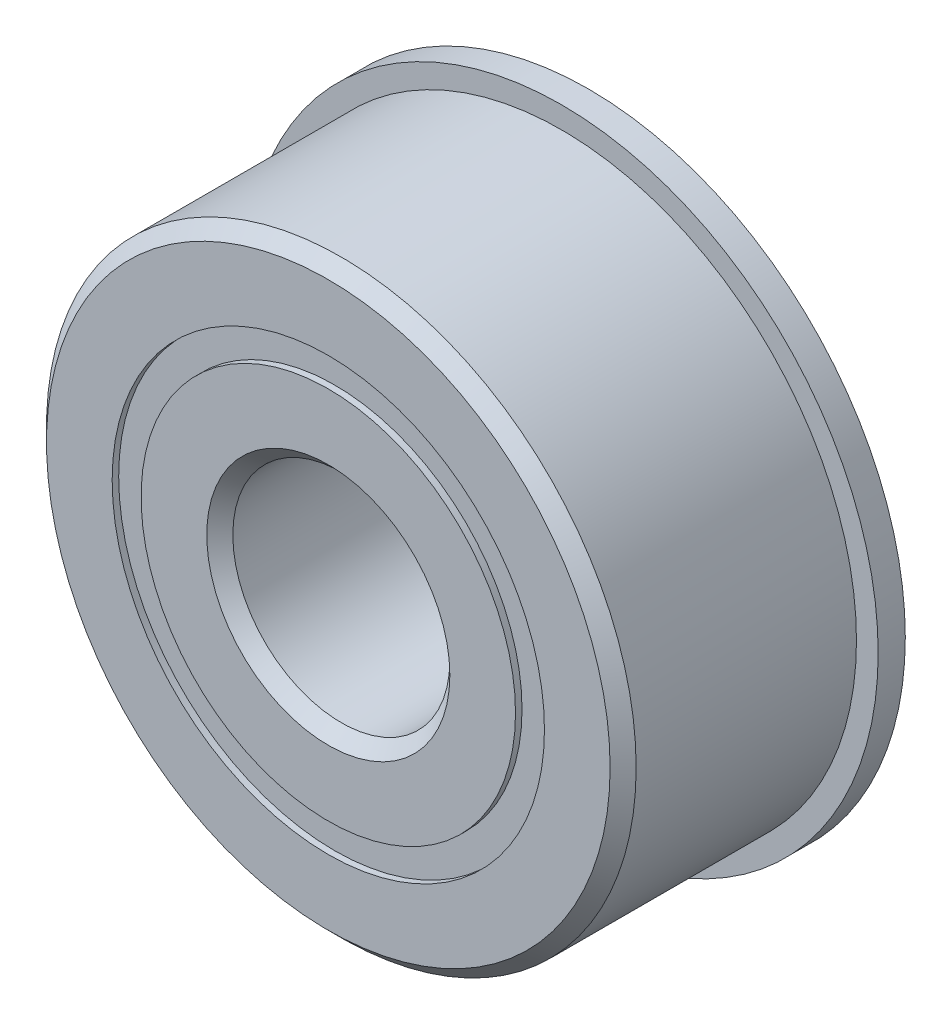
ISO-10303-21;
HEADER;
FILE_DESCRIPTION(('STEP AP214'),'2;1');
FILE_NAME('part.step','',(''),(''),'','','');
FILE_SCHEMA(('AUTOMOTIVE_DESIGN { 1 0 10303 214 1 1 1 1 }'));
ENDSEC;
DATA;
#1=APPLICATION_CONTEXT('core data for automotive mechanical design processes');
#2=APPLICATION_PROTOCOL_DEFINITION('international standard','automotive_design',2000,#1);
#3=PRODUCT_CONTEXT('',#1,'mechanical');
#4=PRODUCT('Part','Part','',(#3));
#5=PRODUCT_RELATED_PRODUCT_CATEGORY('part','',(#4));
#6=PRODUCT_DEFINITION_FORMATION('','',#4);
#7=PRODUCT_DEFINITION_CONTEXT('part definition',#1,'design');
#8=PRODUCT_DEFINITION('design','',#6,#7);
#9=PRODUCT_DEFINITION_SHAPE('','',#8);
#10=(LENGTH_UNIT() NAMED_UNIT(*) SI_UNIT(.MILLI.,.METRE.));
#11=(NAMED_UNIT(*) PLANE_ANGLE_UNIT() SI_UNIT($,.RADIAN.));
#12=(NAMED_UNIT(*) SI_UNIT($,.STERADIAN.) SOLID_ANGLE_UNIT());
#13=UNCERTAINTY_MEASURE_WITH_UNIT(LENGTH_MEASURE(1.E-05),#10,'distance_accuracy_value','');
#14=(GEOMETRIC_REPRESENTATION_CONTEXT(3) GLOBAL_UNCERTAINTY_ASSIGNED_CONTEXT((#13)) GLOBAL_UNIT_ASSIGNED_CONTEXT((#10,
#11,#12)) REPRESENTATION_CONTEXT('',''));
#15=CARTESIAN_POINT('',(0.,0.,0.));
#16=DIRECTION('',(0.,0.,1.));
#17=DIRECTION('',(1.,0.,0.));
#18=AXIS2_PLACEMENT_3D('',#15,#16,#17);
#19=CARTESIAN_POINT('',(0.,5.975,-3.42));
#20=DIRECTION('',(0.,0.,1.));
#21=DIRECTION('',(1.,0.,0.));
#22=AXIS2_PLACEMENT_3D('',#19,#20,#21);
#23=PLANE('',#22);
#24=CARTESIAN_POINT('',(0.,0.,-3.42));
#25=DIRECTION('',(0.,0.,1.));
#26=DIRECTION('',(1.,0.,0.));
#27=AXIS2_PLACEMENT_3D('',#24,#25,#26);
#28=CIRCLE('',#27,5.975);
#29=CARTESIAN_POINT('',(5.975,0.,-3.42));
#30=VERTEX_POINT('',#29);
#31=EDGE_CURVE('E57',#30,#30,#28,.T.);
#32=ORIENTED_EDGE('',*,*,#31,.F.);
#33=EDGE_LOOP('',(#32));
#34=FACE_BOUND('',#33,.T.);
#35=CARTESIAN_POINT('',(0.,0.,-3.42));
#36=DIRECTION('',(0.,0.,1.));
#37=DIRECTION('',(1.,0.,0.));
#38=AXIS2_PLACEMENT_3D('',#35,#36,#37);
#39=CIRCLE('',#38,5.175);
#40=CARTESIAN_POINT('',(5.175,0.,-3.42));
#41=VERTEX_POINT('',#40);
#42=EDGE_CURVE('E11',#41,#41,#39,.T.);
#43=ORIENTED_EDGE('',*,*,#42,.T.);
#44=EDGE_LOOP('',(#43));
#45=FACE_BOUND('',#44,.T.);
#46=ADVANCED_FACE('F43',(#34,#45),#23,.F.);
#47=CARTESIAN_POINT('',(0.,0.,3.6));
#48=DIRECTION('',(0.,0.,1.));
#49=DIRECTION('',(1.,0.,0.));
#50=AXIS2_PLACEMENT_3D('',#47,#48,#49);
#51=CYLINDRICAL_SURFACE('',#50,5.175);
#52=ORIENTED_EDGE('',*,*,#42,.F.);
#53=EDGE_LOOP('',(#52));
#54=FACE_BOUND('',#53,.T.);
#55=CARTESIAN_POINT('',(0.,0.,-1.64924225024706));
#56=DIRECTION('',(0.,0.,1.));
#57=DIRECTION('',(1.,0.,0.));
#58=AXIS2_PLACEMENT_3D('',#55,#56,#57);
#59=CIRCLE('',#58,5.175);
#60=CARTESIAN_POINT('',(5.175,0.,-1.64924225024706));
#61=VERTEX_POINT('',#60);
#62=EDGE_CURVE('E49',#61,#61,#59,.T.);
#63=ORIENTED_EDGE('',*,*,#62,.T.);
#64=EDGE_LOOP('',(#63));
#65=FACE_BOUND('',#64,.T.);
#66=ADVANCED_FACE('F66',(#54,#65),#51,.F.);
#67=CARTESIAN_POINT('',(0.,5.975,-1.64924225024706));
#68=DIRECTION('',(0.,0.,-1.));
#69=DIRECTION('',(-1.,0.,0.));
#70=AXIS2_PLACEMENT_3D('',#67,#68,#69);
#71=PLANE('',#70);
#72=ORIENTED_EDGE('',*,*,#62,.F.);
#73=EDGE_LOOP('',(#72));
#74=FACE_BOUND('',#73,.T.);
#75=CARTESIAN_POINT('',(0.,0.,-1.64924225024706));
#76=DIRECTION('',(0.,0.,1.));
#77=DIRECTION('',(1.,0.,0.));
#78=AXIS2_PLACEMENT_3D('',#75,#76,#77);
#79=CIRCLE('',#78,5.975);
#80=CARTESIAN_POINT('',(5.975,0.,-1.64924225024706));
#81=VERTEX_POINT('',#80);
#82=EDGE_CURVE('E53',#81,#81,#79,.T.);
#83=ORIENTED_EDGE('',*,*,#82,.T.);
#84=EDGE_LOOP('',(#83));
#85=FACE_BOUND('',#84,.T.);
#86=ADVANCED_FACE('F70',(#74,#85),#71,.F.);
#87=CARTESIAN_POINT('',(0.,0.,3.6));
#88=DIRECTION('',(0.,0.,1.));
#89=DIRECTION('',(1.,0.,0.));
#90=AXIS2_PLACEMENT_3D('',#87,#88,#89);
#91=CYLINDRICAL_SURFACE('',#90,5.975);
#92=ORIENTED_EDGE('',*,*,#82,.F.);
#93=EDGE_LOOP('',(#92));
#94=FACE_BOUND('',#93,.T.);
#95=ORIENTED_EDGE('',*,*,#31,.T.);
#96=EDGE_LOOP('',(#95));
#97=FACE_BOUND('',#96,.T.);
#98=ADVANCED_FACE('F63',(#94,#97),#91,.T.);
#99=CLOSED_SHELL('',(#46,#66,#86,#98));
#100=MANIFOLD_SOLID_BREP('B2',#99);
#101=CARTESIAN_POINT('',(0.,5.975,3.42));
#102=DIRECTION('',(0.,0.,-1.));
#103=DIRECTION('',(-1.,0.,0.));
#104=AXIS2_PLACEMENT_3D('',#101,#102,#103);
#105=PLANE('',#104);
#106=CARTESIAN_POINT('',(0.,0.,3.42));
#107=DIRECTION('',(0.,0.,1.));
#108=DIRECTION('',(1.,0.,0.));
#109=AXIS2_PLACEMENT_3D('',#106,#107,#108);
#110=CIRCLE('',#109,5.175);
#111=CARTESIAN_POINT('',(5.175,0.,3.42));
#112=VERTEX_POINT('',#111);
#113=EDGE_CURVE('E42',#112,#112,#110,.T.);
#114=ORIENTED_EDGE('',*,*,#113,.F.);
#115=EDGE_LOOP('',(#114));
#116=FACE_BOUND('',#115,.T.);
#117=CARTESIAN_POINT('',(0.,0.,3.42));
#118=DIRECTION('',(0.,0.,1.));
#119=DIRECTION('',(1.,0.,0.));
#120=AXIS2_PLACEMENT_3D('',#117,#118,#119);
#121=CIRCLE('',#120,5.975);
#122=CARTESIAN_POINT('',(5.975,0.,3.42));
#123=VERTEX_POINT('',#122);
#124=EDGE_CURVE('E124',#123,#123,#121,.T.);
#125=ORIENTED_EDGE('',*,*,#124,.T.);
#126=EDGE_LOOP('',(#125));
#127=FACE_BOUND('',#126,.T.);
#128=ADVANCED_FACE('F110',(#116,#127),#105,.F.);
#129=CARTESIAN_POINT('',(0.,0.,3.6));
#130=DIRECTION('',(0.,0.,1.));
#131=DIRECTION('',(1.,0.,0.));
#132=AXIS2_PLACEMENT_3D('',#129,#130,#131);
#133=CYLINDRICAL_SURFACE('',#132,5.175);
#134=CARTESIAN_POINT('',(0.,0.,1.64924225024706));
#135=DIRECTION('',(0.,0.,1.));
#136=DIRECTION('',(1.,0.,0.));
#137=AXIS2_PLACEMENT_3D('',#134,#135,#136);
#138=CIRCLE('',#137,5.175);
#139=CARTESIAN_POINT('',(5.175,0.,1.64924225024706));
#140=VERTEX_POINT('',#139);
#141=EDGE_CURVE('E116',#140,#140,#138,.T.);
#142=ORIENTED_EDGE('',*,*,#141,.F.);
#143=EDGE_LOOP('',(#142));
#144=FACE_BOUND('',#143,.T.);
#145=ORIENTED_EDGE('',*,*,#113,.T.);
#146=EDGE_LOOP('',(#145));
#147=FACE_BOUND('',#146,.T.);
#148=ADVANCED_FACE('F139',(#144,#147),#133,.F.);
#149=CARTESIAN_POINT('',(0.,5.975,1.64924225024706));
#150=DIRECTION('',(0.,0.,1.));
#151=DIRECTION('',(1.,0.,0.));
#152=AXIS2_PLACEMENT_3D('',#149,#150,#151);
#153=PLANE('',#152);
#154=CARTESIAN_POINT('',(0.,0.,1.64924225024706));
#155=DIRECTION('',(0.,0.,1.));
#156=DIRECTION('',(1.,0.,0.));
#157=AXIS2_PLACEMENT_3D('',#154,#155,#156);
#158=CIRCLE('',#157,5.975);
#159=CARTESIAN_POINT('',(5.975,0.,1.64924225024706));
#160=VERTEX_POINT('',#159);
#161=EDGE_CURVE('E120',#160,#160,#158,.T.);
#162=ORIENTED_EDGE('',*,*,#161,.F.);
#163=EDGE_LOOP('',(#162));
#164=FACE_BOUND('',#163,.T.);
#165=ORIENTED_EDGE('',*,*,#141,.T.);
#166=EDGE_LOOP('',(#165));
#167=FACE_BOUND('',#166,.T.);
#168=ADVANCED_FACE('F134',(#164,#167),#153,.F.);
#169=CARTESIAN_POINT('',(0.,0.,3.6));
#170=DIRECTION('',(0.,0.,1.));
#171=DIRECTION('',(1.,0.,0.));
#172=AXIS2_PLACEMENT_3D('',#169,#170,#171);
#173=CYLINDRICAL_SURFACE('',#172,5.975);
#174=ORIENTED_EDGE('',*,*,#124,.F.);
#175=EDGE_LOOP('',(#174));
#176=FACE_BOUND('',#175,.T.);
#177=ORIENTED_EDGE('',*,*,#161,.T.);
#178=EDGE_LOOP('',(#177));
#179=FACE_BOUND('',#178,.T.);
#180=ADVANCED_FACE('F131',(#176,#179),#173,.T.);
#181=CLOSED_SHELL('',(#128,#148,#168,#180));
#182=MANIFOLD_SOLID_BREP('B6',#181);
#183=CARTESIAN_POINT('',(-3.94212030511495,3.94212030511505,0.));
#184=DIRECTION('',(0.,0.,1.));
#185=DIRECTION('',(-0.707106781186539,0.707106781186556,0.));
#186=AXIS2_PLACEMENT_3D('',#183,#184,#185);
#187=SPHERICAL_SURFACE('',#186,1.64924225024706);
#188=CARTESIAN_POINT('',(-3.94212030511495,3.94212030511505,1.64924225024706));
#189=VERTEX_POINT('',#188);
#190=VERTEX_LOOP('',#189);
#191=FACE_BOUND('',#190,.T.);
#192=ADVANCED_FACE('F177',(#191),#187,.T.);
#193=CLOSED_SHELL('',(#192));
#194=MANIFOLD_SOLID_BREP('B37',#193);
#195=CARTESIAN_POINT('',(-5.575,0.,0.));
#196=DIRECTION('',(0.,0.,1.));
#197=DIRECTION('',(-1.,0.,0.));
#198=AXIS2_PLACEMENT_3D('',#195,#196,#197);
#199=SPHERICAL_SURFACE('',#198,1.64924225024706);
#200=CARTESIAN_POINT('',(-5.575,0.,1.64924225024706));
#201=VERTEX_POINT('',#200);
#202=VERTEX_LOOP('',#201);
#203=FACE_BOUND('',#202,.T.);
#204=ADVANCED_FACE('F197',(#203),#199,.T.);
#205=CLOSED_SHELL('',(#204));
#206=MANIFOLD_SOLID_BREP('B106',#205);
#207=CARTESIAN_POINT('',(-3.94212030511504,-3.94212030511497,0.));
#208=DIRECTION('',(0.,0.,1.));
#209=DIRECTION('',(-0.707106781186554,-0.707106781186541,0.));
#210=AXIS2_PLACEMENT_3D('',#207,#208,#209);
#211=SPHERICAL_SURFACE('',#210,1.64924225024706);
#212=CARTESIAN_POINT('',(-3.94212030511504,-3.94212030511497,1.64924225024706));
#213=VERTEX_POINT('',#212);
#214=VERTEX_LOOP('',#213);
#215=FACE_BOUND('',#214,.T.);
#216=ADVANCED_FACE('F217',(#215),#211,.T.);
#217=CLOSED_SHELL('',(#216));
#218=MANIFOLD_SOLID_BREP('B173',#217);
#219=CARTESIAN_POINT('',(0.,-5.575,0.));
#220=DIRECTION('',(0.,0.,1.));
#221=DIRECTION('',(0.,-1.,0.));
#222=AXIS2_PLACEMENT_3D('',#219,#220,#221);
#223=SPHERICAL_SURFACE('',#222,1.64924225024706);
#224=CARTESIAN_POINT('',(0.,-5.575,1.64924225024706));
#225=VERTEX_POINT('',#224);
#226=VERTEX_LOOP('',#225);
#227=FACE_BOUND('',#226,.T.);
#228=ADVANCED_FACE('F237',(#227),#223,.T.);
#229=CLOSED_SHELL('',(#228));
#230=MANIFOLD_SOLID_BREP('B193',#229);
#231=CARTESIAN_POINT('',(3.94212030511498,-3.94212030511502,0.));
#232=DIRECTION('',(0.,0.,1.));
#233=DIRECTION('',(0.707106781186544,-0.707106781186551,0.));
#234=AXIS2_PLACEMENT_3D('',#231,#232,#233);
#235=SPHERICAL_SURFACE('',#234,1.64924225024706);
#236=CARTESIAN_POINT('',(3.94212030511498,-3.94212030511502,1.64924225024706));
#237=VERTEX_POINT('',#236);
#238=VERTEX_LOOP('',#237);
#239=FACE_BOUND('',#238,.T.);
#240=ADVANCED_FACE('F257',(#239),#235,.T.);
#241=CLOSED_SHELL('',(#240));
#242=MANIFOLD_SOLID_BREP('B213',#241);
#243=CARTESIAN_POINT('',(5.575,0.,0.));
#244=DIRECTION('',(0.,0.,1.));
#245=DIRECTION('',(1.,0.,0.));
#246=AXIS2_PLACEMENT_3D('',#243,#244,#245);
#247=SPHERICAL_SURFACE('',#246,1.64924225024706);
#248=CARTESIAN_POINT('',(5.575,0.,1.64924225024706));
#249=VERTEX_POINT('',#248);
#250=VERTEX_LOOP('',#249);
#251=FACE_BOUND('',#250,.T.);
#252=ADVANCED_FACE('F277',(#251),#247,.T.);
#253=CLOSED_SHELL('',(#252));
#254=MANIFOLD_SOLID_BREP('B233',#253);
#255=CARTESIAN_POINT('',(3.94212030511501,3.942120305115,0.));
#256=DIRECTION('',(0.,0.,1.));
#257=DIRECTION('',(0.707106781186549,0.707106781186546,0.));
#258=AXIS2_PLACEMENT_3D('',#255,#256,#257);
#259=SPHERICAL_SURFACE('',#258,1.64924225024706);
#260=CARTESIAN_POINT('',(3.94212030511501,3.942120305115,1.64924225024706));
#261=VERTEX_POINT('',#260);
#262=VERTEX_LOOP('',#261);
#263=FACE_BOUND('',#262,.T.);
#264=ADVANCED_FACE('F297',(#263),#259,.T.);
#265=CLOSED_SHELL('',(#264));
#266=MANIFOLD_SOLID_BREP('B253',#265);
#267=CARTESIAN_POINT('',(0.,5.575,0.));
#268=DIRECTION('',(0.,0.,1.));
#269=DIRECTION('',(0.,1.,0.));
#270=AXIS2_PLACEMENT_3D('',#267,#268,#269);
#271=SPHERICAL_SURFACE('',#270,1.64924225024706);
#272=CARTESIAN_POINT('',(0.,5.575,1.64924225024706));
#273=VERTEX_POINT('',#272);
#274=VERTEX_LOOP('',#273);
#275=FACE_BOUND('',#274,.T.);
#276=ADVANCED_FACE('F319',(#275),#271,.T.);
#277=CLOSED_SHELL('',(#276));
#278=MANIFOLD_SOLID_BREP('B273',#277);
#279=CARTESIAN_POINT('',(0.,5.175,3.6));
#280=DIRECTION('',(0.,0.,-1.));
#281=DIRECTION('',(-1.,0.,0.));
#282=AXIS2_PLACEMENT_3D('',#279,#280,#281);
#283=PLANE('',#282);
#284=CARTESIAN_POINT('',(0.,0.,3.6));
#285=DIRECTION('',(0.,0.,1.));
#286=DIRECTION('',(1.,0.,0.));
#287=AXIS2_PLACEMENT_3D('',#284,#285,#286);
#288=CIRCLE('',#287,3.36);
#289=CARTESIAN_POINT('',(3.36,0.,3.6));
#290=VERTEX_POINT('',#289);
#291=EDGE_CURVE('E366',#290,#290,#288,.T.);
#292=ORIENTED_EDGE('',*,*,#291,.F.);
#293=EDGE_LOOP('',(#292));
#294=FACE_BOUND('',#293,.T.);
#295=CARTESIAN_POINT('',(0.,0.,3.6));
#296=DIRECTION('',(0.,0.,1.));
#297=DIRECTION('',(1.,0.,0.));
#298=AXIS2_PLACEMENT_3D('',#295,#296,#297);
#299=CIRCLE('',#298,5.175);
#300=CARTESIAN_POINT('',(5.175,0.,3.6));
#301=VERTEX_POINT('',#300);
#302=EDGE_CURVE('E318',#301,#301,#299,.T.);
#303=ORIENTED_EDGE('',*,*,#302,.T.);
#304=EDGE_LOOP('',(#303));
#305=FACE_BOUND('',#304,.T.);
#306=ADVANCED_FACE('F338',(#294,#305),#283,.F.);
#307=CARTESIAN_POINT('',(0.,0.,3.6));
#308=DIRECTION('',(0.,0.,1.));
#309=DIRECTION('',(1.,0.,0.));
#310=AXIS2_PLACEMENT_3D('',#307,#308,#309);
#311=CYLINDRICAL_SURFACE('',#310,5.175);
#312=ORIENTED_EDGE('',*,*,#302,.F.);
#313=EDGE_LOOP('',(#312));
#314=FACE_BOUND('',#313,.T.);
#315=CARTESIAN_POINT('',(0.,0.,1.6));
#316=DIRECTION('',(0.,0.,1.));
#317=DIRECTION('',(1.,0.,0.));
#318=AXIS2_PLACEMENT_3D('',#315,#316,#317);
#319=CIRCLE('',#318,5.175);
#320=CARTESIAN_POINT('',(5.175,0.,1.6));
#321=VERTEX_POINT('',#320);
#322=EDGE_CURVE('E344',#321,#321,#319,.T.);
#323=ORIENTED_EDGE('',*,*,#322,.T.);
#324=EDGE_LOOP('',(#323));
#325=FACE_BOUND('',#324,.T.);
#326=ADVANCED_FACE('F373',(#314,#325),#311,.T.);
#327=CARTESIAN_POINT('',(0.,0.,0.));
#328=DIRECTION('',(0.,0.,1.));
#329=DIRECTION('',(1.,0.,0.));
#330=AXIS2_PLACEMENT_3D('',#327,#328,#329);
#331=TOROIDAL_SURFACE('',#330,5.575,1.64924225024706);
#332=ORIENTED_EDGE('',*,*,#322,.F.);
#333=EDGE_LOOP('',(#332));
#334=FACE_BOUND('',#333,.T.);
#335=CARTESIAN_POINT('',(0.,0.,-1.6));
#336=DIRECTION('',(0.,0.,1.));
#337=DIRECTION('',(1.,0.,0.));
#338=AXIS2_PLACEMENT_3D('',#335,#336,#337);
#339=CIRCLE('',#338,5.175);
#340=CARTESIAN_POINT('',(5.175,0.,-1.6));
#341=VERTEX_POINT('',#340);
#342=EDGE_CURVE('E348',#341,#341,#339,.T.);
#343=ORIENTED_EDGE('',*,*,#342,.T.);
#344=EDGE_LOOP('',(#343));
#345=FACE_BOUND('',#344,.T.);
#346=ADVANCED_FACE('F377',(#334,#345),#331,.F.);
#347=CARTESIAN_POINT('',(0.,0.,3.6));
#348=DIRECTION('',(0.,0.,1.));
#349=DIRECTION('',(1.,0.,0.));
#350=AXIS2_PLACEMENT_3D('',#347,#348,#349);
#351=CYLINDRICAL_SURFACE('',#350,5.175);
#352=ORIENTED_EDGE('',*,*,#342,.F.);
#353=EDGE_LOOP('',(#352));
#354=FACE_BOUND('',#353,.T.);
#355=CARTESIAN_POINT('',(0.,0.,-3.6));
#356=DIRECTION('',(0.,0.,1.));
#357=DIRECTION('',(1.,0.,0.));
#358=AXIS2_PLACEMENT_3D('',#355,#356,#357);
#359=CIRCLE('',#358,5.175);
#360=CARTESIAN_POINT('',(5.175,0.,-3.6));
#361=VERTEX_POINT('',#360);
#362=EDGE_CURVE('E352',#361,#361,#359,.T.);
#363=ORIENTED_EDGE('',*,*,#362,.T.);
#364=EDGE_LOOP('',(#363));
#365=FACE_BOUND('',#364,.T.);
#366=ADVANCED_FACE('F382',(#354,#365),#351,.T.);
#367=CARTESIAN_POINT('',(0.,3.36,-3.6));
#368=DIRECTION('',(0.,0.,1.));
#369=DIRECTION('',(1.,0.,0.));
#370=AXIS2_PLACEMENT_3D('',#367,#368,#369);
#371=PLANE('',#370);
#372=ORIENTED_EDGE('',*,*,#362,.F.);
#373=EDGE_LOOP('',(#372));
#374=FACE_BOUND('',#373,.T.);
#375=CARTESIAN_POINT('',(0.,0.,-3.6));
#376=DIRECTION('',(0.,0.,1.));
#377=DIRECTION('',(1.,0.,0.));
#378=AXIS2_PLACEMENT_3D('',#375,#376,#377);
#379=CIRCLE('',#378,3.36);
#380=CARTESIAN_POINT('',(3.36,0.,-3.6));
#381=VERTEX_POINT('',#380);
#382=EDGE_CURVE('E357',#381,#381,#379,.T.);
#383=ORIENTED_EDGE('',*,*,#382,.T.);
#384=EDGE_LOOP('',(#383));
#385=FACE_BOUND('',#384,.T.);
#386=ADVANCED_FACE('F388',(#374,#385),#371,.F.);
#387=CARTESIAN_POINT('',(0.,0.,-3.24));
#388=DIRECTION('',(0.,0.,-1.));
#389=DIRECTION('',(-1.,0.,0.));
#390=AXIS2_PLACEMENT_3D('',#387,#388,#389);
#391=CONICAL_SURFACE('',#390,3.,0.785398163397447);
#392=ORIENTED_EDGE('',*,*,#382,.F.);
#393=EDGE_LOOP('',(#392));
#394=FACE_BOUND('',#393,.T.);
#395=CARTESIAN_POINT('',(0.,0.,-3.24));
#396=DIRECTION('',(0.,0.,1.));
#397=DIRECTION('',(1.,0.,0.));
#398=AXIS2_PLACEMENT_3D('',#395,#396,#397);
#399=CIRCLE('',#398,3.);
#400=CARTESIAN_POINT('',(3.,0.,-3.24));
#401=VERTEX_POINT('',#400);
#402=EDGE_CURVE('E360',#401,#401,#399,.T.);
#403=ORIENTED_EDGE('',*,*,#402,.T.);
#404=EDGE_LOOP('',(#403));
#405=FACE_BOUND('',#404,.T.);
#406=ADVANCED_FACE('F392',(#394,#405),#391,.F.);
#407=CARTESIAN_POINT('',(0.,0.,3.6));
#408=DIRECTION('',(0.,0.,1.));
#409=DIRECTION('',(1.,0.,0.));
#410=AXIS2_PLACEMENT_3D('',#407,#408,#409);
#411=CYLINDRICAL_SURFACE('',#410,3.);
#412=ORIENTED_EDGE('',*,*,#402,.F.);
#413=EDGE_LOOP('',(#412));
#414=FACE_BOUND('',#413,.T.);
#415=CARTESIAN_POINT('',(0.,0.,3.24));
#416=DIRECTION('',(0.,0.,1.));
#417=DIRECTION('',(1.,0.,0.));
#418=AXIS2_PLACEMENT_3D('',#415,#416,#417);
#419=CIRCLE('',#418,3.);
#420=CARTESIAN_POINT('',(3.,0.,3.24));
#421=VERTEX_POINT('',#420);
#422=EDGE_CURVE('E363',#421,#421,#419,.T.);
#423=ORIENTED_EDGE('',*,*,#422,.T.);
#424=EDGE_LOOP('',(#423));
#425=FACE_BOUND('',#424,.T.);
#426=ADVANCED_FACE('F396',(#414,#425),#411,.F.);
#427=CARTESIAN_POINT('',(0.,0.,3.6));
#428=DIRECTION('',(0.,0.,1.));
#429=DIRECTION('',(1.,0.,0.));
#430=AXIS2_PLACEMENT_3D('',#427,#428,#429);
#431=CONICAL_SURFACE('',#430,3.36,0.78539816339745);
#432=ORIENTED_EDGE('',*,*,#422,.F.);
#433=EDGE_LOOP('',(#432));
#434=FACE_BOUND('',#433,.T.);
#435=ORIENTED_EDGE('',*,*,#291,.T.);
#436=EDGE_LOOP('',(#435));
#437=FACE_BOUND('',#436,.T.);
#438=ADVANCED_FACE('F370',(#434,#437),#431,.F.);
#439=CLOSED_SHELL('',(#306,#326,#346,#366,#386,#406,#426,#438));
#440=MANIFOLD_SOLID_BREP('B293',#439);
#441=CARTESIAN_POINT('',(0.,0.,3.24));
#442=DIRECTION('',(0.,0.,-1.));
#443=DIRECTION('',(-1.,0.,0.));
#444=AXIS2_PLACEMENT_3D('',#441,#442,#443);
#445=CONICAL_SURFACE('',#444,8.15,0.785398163397447);
#446=CARTESIAN_POINT('',(0.,0.,3.6));
#447=DIRECTION('',(0.,0.,1.));
#448=DIRECTION('',(1.,0.,0.));
#449=AXIS2_PLACEMENT_3D('',#446,#447,#448);
#450=CIRCLE('',#449,7.79);
#451=CARTESIAN_POINT('',(7.79,0.,3.6));
#452=VERTEX_POINT('',#451);
#453=EDGE_CURVE('E481',#452,#452,#450,.T.);
#454=ORIENTED_EDGE('',*,*,#453,.F.);
#455=EDGE_LOOP('',(#454));
#456=FACE_BOUND('',#455,.T.);
#457=CARTESIAN_POINT('',(0.,0.,3.24));
#458=DIRECTION('',(0.,0.,1.));
#459=DIRECTION('',(1.,0.,0.));
#460=AXIS2_PLACEMENT_3D('',#457,#458,#459);
#461=CIRCLE('',#460,8.15);
#462=CARTESIAN_POINT('',(8.15,0.,3.24));
#463=VERTEX_POINT('',#462);
#464=EDGE_CURVE('E337',#463,#463,#461,.T.);
#465=ORIENTED_EDGE('',*,*,#464,.T.);
#466=EDGE_LOOP('',(#465));
#467=FACE_BOUND('',#466,.T.);
#468=ADVANCED_FACE('F459',(#456,#467),#445,.T.);
#469=CARTESIAN_POINT('',(0.,0.,3.6));
#470=DIRECTION('',(0.,0.,1.));
#471=DIRECTION('',(1.,0.,0.));
#472=AXIS2_PLACEMENT_3D('',#469,#470,#471);
#473=CYLINDRICAL_SURFACE('',#472,8.15);
#474=CARTESIAN_POINT('',(0.,0.,-2.85));
#475=DIRECTION('',(0.,0.,1.));
#476=DIRECTION('',(1.,0.,0.));
#477=AXIS2_PLACEMENT_3D('',#474,#475,#476);
#478=CIRCLE('',#477,8.15);
#479=CARTESIAN_POINT('',(8.15,0.,-2.85));
#480=VERTEX_POINT('',#479);
#481=EDGE_CURVE('E484',#480,#480,#478,.T.);
#482=ORIENTED_EDGE('',*,*,#481,.T.);
#483=EDGE_LOOP('',(#482));
#484=FACE_BOUND('',#483,.T.);
#485=ORIENTED_EDGE('',*,*,#464,.F.);
#486=EDGE_LOOP('',(#485));
#487=FACE_BOUND('',#486,.T.);
#488=ADVANCED_FACE('F504',(#484,#487),#473,.T.);
#489=CARTESIAN_POINT('',(0.,7.79,-3.6));
#490=DIRECTION('',(0.,0.,1.));
#491=DIRECTION('',(1.,0.,0.));
#492=AXIS2_PLACEMENT_3D('',#489,#490,#491);
#493=PLANE('',#492);
#494=CARTESIAN_POINT('',(0.,0.,-3.6));
#495=DIRECTION('',(0.,0.,1.));
#496=DIRECTION('',(1.,0.,0.));
#497=AXIS2_PLACEMENT_3D('',#494,#495,#496);
#498=CIRCLE('',#497,5.975);
#499=CARTESIAN_POINT('',(5.975,0.,-3.6));
#500=VERTEX_POINT('',#499);
#501=EDGE_CURVE('E465',#500,#500,#498,.T.);
#502=ORIENTED_EDGE('',*,*,#501,.T.);
#503=EDGE_LOOP('',(#502));
#504=FACE_BOUND('',#503,.T.);
#505=CARTESIAN_POINT('',(0.,0.,-3.6));
#506=DIRECTION('',(0.,0.,-1.));
#507=DIRECTION('',(-1.,0.,0.));
#508=AXIS2_PLACEMENT_3D('',#505,#506,#507);
#509=CIRCLE('',#508,8.75);
#510=CARTESIAN_POINT('',(-8.75,0.,-3.6));
#511=VERTEX_POINT('',#510);
#512=EDGE_CURVE('E487',#511,#511,#509,.T.);
#513=ORIENTED_EDGE('',*,*,#512,.T.);
#514=EDGE_LOOP('',(#513));
#515=FACE_BOUND('',#514,.T.);
#516=ADVANCED_FACE('F507',(#504,#515),#493,.F.);
#517=CARTESIAN_POINT('',(0.,0.,3.6));
#518=DIRECTION('',(0.,0.,1.));
#519=DIRECTION('',(1.,0.,0.));
#520=AXIS2_PLACEMENT_3D('',#517,#518,#519);
#521=CYLINDRICAL_SURFACE('',#520,5.975);
#522=CARTESIAN_POINT('',(0.,0.,-1.6));
#523=DIRECTION('',(0.,0.,1.));
#524=DIRECTION('',(1.,0.,0.));
#525=AXIS2_PLACEMENT_3D('',#522,#523,#524);
#526=CIRCLE('',#525,5.975);
#527=CARTESIAN_POINT('',(5.975,0.,-1.6));
#528=VERTEX_POINT('',#527);
#529=EDGE_CURVE('E469',#528,#528,#526,.T.);
#530=ORIENTED_EDGE('',*,*,#529,.T.);
#531=EDGE_LOOP('',(#530));
#532=FACE_BOUND('',#531,.T.);
#533=ORIENTED_EDGE('',*,*,#501,.F.);
#534=EDGE_LOOP('',(#533));
#535=FACE_BOUND('',#534,.T.);
#536=ADVANCED_FACE('F512',(#532,#535),#521,.F.);
#537=CARTESIAN_POINT('',(0.,0.,0.));
#538=DIRECTION('',(0.,0.,1.));
#539=DIRECTION('',(1.,0.,0.));
#540=AXIS2_PLACEMENT_3D('',#537,#538,#539);
#541=TOROIDAL_SURFACE('',#540,5.575,1.64924225024706);
#542=ORIENTED_EDGE('',*,*,#529,.F.);
#543=EDGE_LOOP('',(#542));
#544=FACE_BOUND('',#543,.T.);
#545=CARTESIAN_POINT('',(0.,0.,1.6));
#546=DIRECTION('',(0.,0.,1.));
#547=DIRECTION('',(1.,0.,0.));
#548=AXIS2_PLACEMENT_3D('',#545,#546,#547);
#549=CIRCLE('',#548,5.975);
#550=CARTESIAN_POINT('',(5.975,0.,1.6));
#551=VERTEX_POINT('',#550);
#552=EDGE_CURVE('E473',#551,#551,#549,.T.);
#553=ORIENTED_EDGE('',*,*,#552,.T.);
#554=EDGE_LOOP('',(#553));
#555=FACE_BOUND('',#554,.T.);
#556=ADVANCED_FACE('F518',(#544,#555),#541,.F.);
#557=CARTESIAN_POINT('',(0.,0.,3.6));
#558=DIRECTION('',(0.,0.,1.));
#559=DIRECTION('',(1.,0.,0.));
#560=AXIS2_PLACEMENT_3D('',#557,#558,#559);
#561=CYLINDRICAL_SURFACE('',#560,5.975);
#562=ORIENTED_EDGE('',*,*,#552,.F.);
#563=EDGE_LOOP('',(#562));
#564=FACE_BOUND('',#563,.T.);
#565=CARTESIAN_POINT('',(0.,0.,3.6));
#566=DIRECTION('',(0.,0.,1.));
#567=DIRECTION('',(1.,0.,0.));
#568=AXIS2_PLACEMENT_3D('',#565,#566,#567);
#569=CIRCLE('',#568,5.975);
#570=CARTESIAN_POINT('',(5.975,0.,3.6));
#571=VERTEX_POINT('',#570);
#572=EDGE_CURVE('E478',#571,#571,#569,.T.);
#573=ORIENTED_EDGE('',*,*,#572,.T.);
#574=EDGE_LOOP('',(#573));
#575=FACE_BOUND('',#574,.T.);
#576=ADVANCED_FACE('F522',(#564,#575),#561,.F.);
#577=CARTESIAN_POINT('',(0.,7.79,3.6));
#578=DIRECTION('',(0.,0.,-1.));
#579=DIRECTION('',(-1.,0.,0.));
#580=AXIS2_PLACEMENT_3D('',#577,#578,#579);
#581=PLANE('',#580);
#582=ORIENTED_EDGE('',*,*,#572,.F.);
#583=EDGE_LOOP('',(#582));
#584=FACE_BOUND('',#583,.T.);
#585=ORIENTED_EDGE('',*,*,#453,.T.);
#586=EDGE_LOOP('',(#585));
#587=FACE_BOUND('',#586,.T.);
#588=ADVANCED_FACE('F500',(#584,#587),#581,.F.);
#589=CARTESIAN_POINT('',(0.,5.975,-2.85));
#590=DIRECTION('',(0.,0.,1.));
#591=DIRECTION('',(1.,0.,0.));
#592=AXIS2_PLACEMENT_3D('',#589,#590,#591);
#593=PLANE('',#592);
#594=CARTESIAN_POINT('',(0.,0.,-2.85));
#595=DIRECTION('',(0.,0.,-1.));
#596=DIRECTION('',(-1.,0.,0.));
#597=AXIS2_PLACEMENT_3D('',#594,#595,#596);
#598=CIRCLE('',#597,8.75);
#599=CARTESIAN_POINT('',(-8.75,0.,-2.85));
#600=VERTEX_POINT('',#599);
#601=EDGE_CURVE('E490',#600,#600,#598,.T.);
#602=ORIENTED_EDGE('',*,*,#601,.F.);
#603=EDGE_LOOP('',(#602));
#604=FACE_BOUND('',#603,.T.);
#605=ORIENTED_EDGE('',*,*,#481,.F.);
#606=EDGE_LOOP('',(#605));
#607=FACE_BOUND('',#606,.T.);
#608=ADVANCED_FACE('F497',(#604,#607),#593,.T.);
#609=CARTESIAN_POINT('',(0.,0.,-3.6));
#610=DIRECTION('',(0.,0.,-1.));
#611=DIRECTION('',(-1.,0.,0.));
#612=AXIS2_PLACEMENT_3D('',#609,#610,#611);
#613=CYLINDRICAL_SURFACE('',#612,8.75);
#614=ORIENTED_EDGE('',*,*,#601,.T.);
#615=EDGE_LOOP('',(#614));
#616=FACE_BOUND('',#615,.T.);
#617=ORIENTED_EDGE('',*,*,#512,.F.);
#618=EDGE_LOOP('',(#617));
#619=FACE_BOUND('',#618,.T.);
#620=ADVANCED_FACE('F494',(#616,#619),#613,.T.);
#621=CLOSED_SHELL('',(#468,#488,#516,#536,#556,#576,#588,#608,#620));
#622=MANIFOLD_SOLID_BREP('B313',#621);
#623=ADVANCED_BREP_SHAPE_REPRESENTATION('',(#18,#100,#182,#194,#206,#218,#230,#242,#254,#266,
#278,#440,#622),#14);
#624=SHAPE_DEFINITION_REPRESENTATION(#9,#623);
ENDSEC;
END-ISO-10303-21;
